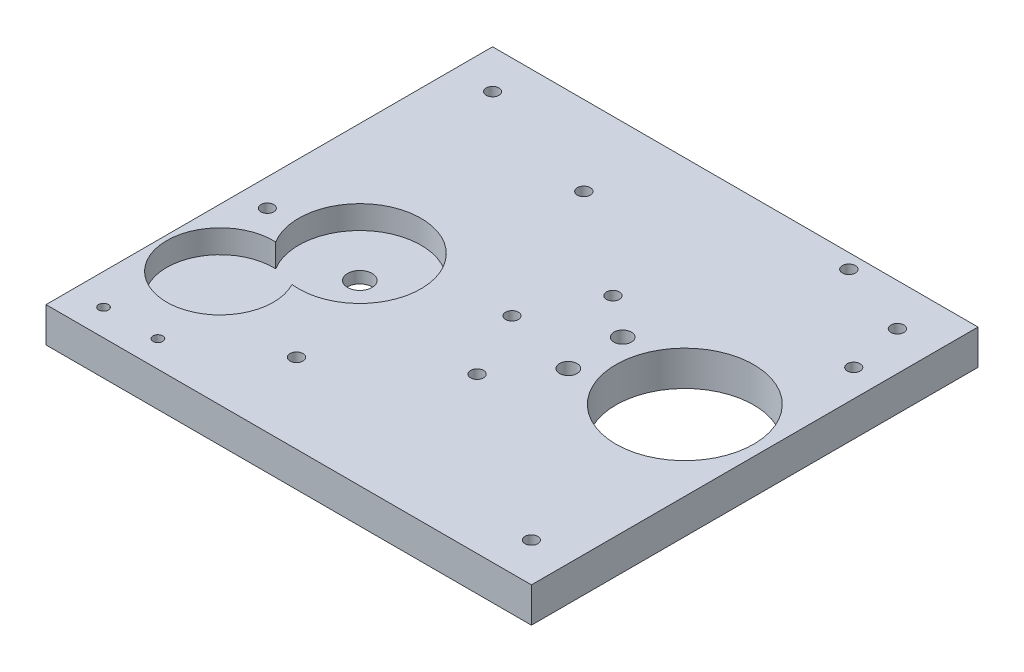
ISO-10303-21;
HEADER;
FILE_DESCRIPTION(('STEP AP214'),'2;1');
FILE_NAME('part.step','',(''),(''),'','','');
FILE_SCHEMA(('AUTOMOTIVE_DESIGN { 1 0 10303 214 1 1 1 1 }'));
ENDSEC;
DATA;
#1=APPLICATION_CONTEXT('core data for automotive mechanical design processes');
#2=APPLICATION_PROTOCOL_DEFINITION('international standard','automotive_design',2000,#1);
#3=PRODUCT_CONTEXT('',#1,'mechanical');
#4=PRODUCT('Part','Part','',(#3));
#5=PRODUCT_RELATED_PRODUCT_CATEGORY('part','',(#4));
#6=PRODUCT_DEFINITION_FORMATION('','',#4);
#7=PRODUCT_DEFINITION_CONTEXT('part definition',#1,'design');
#8=PRODUCT_DEFINITION('design','',#6,#7);
#9=PRODUCT_DEFINITION_SHAPE('','',#8);
#10=(LENGTH_UNIT() NAMED_UNIT(*) SI_UNIT(.MILLI.,.METRE.));
#11=(NAMED_UNIT(*) PLANE_ANGLE_UNIT() SI_UNIT($,.RADIAN.));
#12=(NAMED_UNIT(*) SI_UNIT($,.STERADIAN.) SOLID_ANGLE_UNIT());
#13=UNCERTAINTY_MEASURE_WITH_UNIT(LENGTH_MEASURE(1.E-05),#10,'distance_accuracy_value','');
#14=(GEOMETRIC_REPRESENTATION_CONTEXT(3) GLOBAL_UNCERTAINTY_ASSIGNED_CONTEXT((#13)) GLOBAL_UNIT_ASSIGNED_CONTEXT((#10,
#11,#12)) REPRESENTATION_CONTEXT('',''));
#15=CARTESIAN_POINT('',(0.,0.,0.));
#16=DIRECTION('',(0.,0.,1.));
#17=DIRECTION('',(1.,0.,0.));
#18=AXIS2_PLACEMENT_3D('',#15,#16,#17);
#19=CARTESIAN_POINT('',(0.,9.,0.));
#20=DIRECTION('',(0.,-1.,0.));
#21=DIRECTION('',(0.,0.,-1.));
#22=AXIS2_PLACEMENT_3D('',#19,#20,#21);
#23=PLANE('',#22);
#24=CARTESIAN_POINT('',(9.99999999999999,9.,-105.));
#25=DIRECTION('',(0.,1.,0.));
#26=DIRECTION('',(0.,0.,1.));
#27=AXIS2_PLACEMENT_3D('',#24,#25,#26);
#28=CIRCLE('',#27,1.64999999999999);
#29=CARTESIAN_POINT('',(9.99999999999999,9.,-103.35));
#30=VERTEX_POINT('',#29);
#31=EDGE_CURVE('E647',#30,#30,#28,.T.);
#32=ORIENTED_EDGE('',*,*,#31,.F.);
#33=EDGE_LOOP('',(#32));
#34=FACE_BOUND('',#33,.T.);
#35=CARTESIAN_POINT('',(118.,9.,-90.));
#36=DIRECTION('',(0.,1.,0.));
#37=DIRECTION('',(0.,0.,1.));
#38=AXIS2_PLACEMENT_3D('',#35,#36,#37);
#39=CIRCLE('',#38,1.64999999999998);
#40=CARTESIAN_POINT('',(118.,9.,-88.35));
#41=VERTEX_POINT('',#40);
#42=EDGE_CURVE('E238',#41,#41,#39,.T.);
#43=ORIENTED_EDGE('',*,*,#42,.F.);
#44=EDGE_LOOP('',(#43));
#45=FACE_BOUND('',#44,.T.);
#46=CARTESIAN_POINT('',(115.,9.,-10.));
#47=DIRECTION('',(0.,1.,0.));
#48=DIRECTION('',(0.,0.,1.));
#49=AXIS2_PLACEMENT_3D('',#46,#47,#48);
#50=CIRCLE('',#49,1.64999999999998);
#51=CARTESIAN_POINT('',(115.,9.,-8.35000000000001));
#52=VERTEX_POINT('',#51);
#53=EDGE_CURVE('E227',#52,#52,#50,.T.);
#54=ORIENTED_EDGE('',*,*,#53,.F.);
#55=EDGE_LOOP('',(#54));
#56=FACE_BOUND('',#55,.T.);
#57=CARTESIAN_POINT('',(7.,9.,-50.));
#58=DIRECTION('',(0.,1.,0.));
#59=DIRECTION('',(0.,0.,1.));
#60=AXIS2_PLACEMENT_3D('',#57,#58,#59);
#61=CIRCLE('',#60,1.64999999999999);
#62=CARTESIAN_POINT('',(7.,9.,-48.35));
#63=VERTEX_POINT('',#62);
#64=EDGE_CURVE('E226',#63,#63,#61,.T.);
#65=ORIENTED_EDGE('',*,*,#64,.F.);
#66=EDGE_LOOP('',(#65));
#67=FACE_BOUND('',#66,.T.);
#68=CARTESIAN_POINT('',(7.99999999999999,9.,-6.82025553603353));
#69=DIRECTION('',(0.,1.,0.));
#70=DIRECTION('',(0.,0.,1.));
#71=AXIS2_PLACEMENT_3D('',#68,#69,#70);
#72=CIRCLE('',#71,1.25);
#73=CARTESIAN_POINT('',(7.99999999999999,9.,-5.57025553603353));
#74=VERTEX_POINT('',#73);
#75=EDGE_CURVE('E116',#74,#74,#72,.T.);
#76=ORIENTED_EDGE('',*,*,#75,.F.);
#77=EDGE_LOOP('',(#76));
#78=FACE_BOUND('',#77,.T.);
#79=CARTESIAN_POINT('',(22.,9.,-6.82025553603353));
#80=DIRECTION('',(0.,1.,0.));
#81=DIRECTION('',(0.,0.,1.));
#82=AXIS2_PLACEMENT_3D('',#79,#80,#81);
#83=CIRCLE('',#82,1.25);
#84=CARTESIAN_POINT('',(22.,9.,-5.57025553603354));
#85=VERTEX_POINT('',#84);
#86=EDGE_CURVE('E115',#85,#85,#83,.T.);
#87=ORIENTED_EDGE('',*,*,#86,.F.);
#88=EDGE_LOOP('',(#87));
#89=FACE_BOUND('',#88,.T.);
#90=CARTESIAN_POINT('',(81.5,9.,-53.));
#91=DIRECTION('',(0.,1.,0.));
#92=DIRECTION('',(0.,0.,-1.));
#93=AXIS2_PLACEMENT_3D('',#90,#91,#92);
#94=CIRCLE('',#93,2.24999999999999);
#95=CARTESIAN_POINT('',(81.5,9.,-55.25));
#96=VERTEX_POINT('',#95);
#97=EDGE_CURVE('E128',#96,#96,#94,.T.);
#98=ORIENTED_EDGE('',*,*,#97,.F.);
#99=EDGE_LOOP('',(#98));
#100=FACE_BOUND('',#99,.T.);
#101=CARTESIAN_POINT('',(44.,9.,-20.5));
#102=DIRECTION('',(0.,1.,0.));
#103=DIRECTION('',(0.,0.,-1.));
#104=AXIS2_PLACEMENT_3D('',#101,#102,#103);
#105=CIRCLE('',#104,1.675);
#106=CARTESIAN_POINT('',(44.,9.,-22.175));
#107=VERTEX_POINT('',#106);
#108=EDGE_CURVE('E163',#107,#107,#105,.T.);
#109=ORIENTED_EDGE('',*,*,#108,.F.);
#110=EDGE_LOOP('',(#109));
#111=FACE_BOUND('',#110,.T.);
#112=CARTESIAN_POINT('',(71.,9.,-40.));
#113=DIRECTION('',(0.,1.,0.));
#114=DIRECTION('',(0.,0.,-1.));
#115=AXIS2_PLACEMENT_3D('',#112,#113,#114);
#116=CIRCLE('',#115,1.675);
#117=CARTESIAN_POINT('',(71.,9.,-41.675));
#118=VERTEX_POINT('',#117);
#119=EDGE_CURVE('E157',#118,#118,#116,.T.);
#120=ORIENTED_EDGE('',*,*,#119,.F.);
#121=EDGE_LOOP('',(#120));
#122=FACE_BOUND('',#121,.T.);
#123=CARTESIAN_POINT('',(115.,9.,-104.25));
#124=DIRECTION('',(0.,1.,0.));
#125=DIRECTION('',(0.,0.,1.));
#126=AXIS2_PLACEMENT_3D('',#123,#124,#125);
#127=CIRCLE('',#126,1.675);
#128=CARTESIAN_POINT('',(115.,9.,-102.575));
#129=VERTEX_POINT('',#128);
#130=EDGE_CURVE('E151',#129,#129,#127,.T.);
#131=ORIENTED_EDGE('',*,*,#130,.F.);
#132=EDGE_LOOP('',(#131));
#133=FACE_BOUND('',#132,.T.);
#134=CARTESIAN_POINT('',(95.5,9.,-111.25));
#135=DIRECTION('',(0.,1.,0.));
#136=DIRECTION('',(0.,0.,1.));
#137=AXIS2_PLACEMENT_3D('',#134,#135,#136);
#138=CIRCLE('',#137,1.675);
#139=CARTESIAN_POINT('',(95.5,9.,-109.575));
#140=VERTEX_POINT('',#139);
#141=EDGE_CURVE('E145',#140,#140,#138,.T.);
#142=ORIENTED_EDGE('',*,*,#141,.F.);
#143=EDGE_LOOP('',(#142));
#144=FACE_BOUND('',#143,.T.);
#145=CARTESIAN_POINT('',(81.5,9.,-67.));
#146=DIRECTION('',(0.,1.,0.));
#147=DIRECTION('',(0.,0.,1.));
#148=AXIS2_PLACEMENT_3D('',#145,#146,#147);
#149=CIRCLE('',#148,2.24999999999999);
#150=CARTESIAN_POINT('',(81.5,9.,-64.75));
#151=VERTEX_POINT('',#150);
#152=EDGE_CURVE('E139',#151,#151,#149,.T.);
#153=ORIENTED_EDGE('',*,*,#152,.F.);
#154=EDGE_LOOP('',(#153));
#155=FACE_BOUND('',#154,.T.);
#156=CARTESIAN_POINT('',(44.,9.,-94.5));
#157=DIRECTION('',(0.,1.,0.));
#158=DIRECTION('',(0.,0.,1.));
#159=AXIS2_PLACEMENT_3D('',#156,#157,#158);
#160=CIRCLE('',#159,1.675);
#161=CARTESIAN_POINT('',(44.,9.,-92.825));
#162=VERTEX_POINT('',#161);
#163=EDGE_CURVE('E133',#162,#162,#160,.T.);
#164=ORIENTED_EDGE('',*,*,#163,.F.);
#165=EDGE_LOOP('',(#164));
#166=FACE_BOUND('',#165,.T.);
#167=CARTESIAN_POINT('',(71.,9.,-75.));
#168=DIRECTION('',(0.,1.,0.));
#169=DIRECTION('',(0.,0.,1.));
#170=AXIS2_PLACEMENT_3D('',#167,#168,#169);
#171=CIRCLE('',#170,1.675);
#172=CARTESIAN_POINT('',(71.,9.,-73.325));
#173=VERTEX_POINT('',#172);
#174=EDGE_CURVE('E132',#173,#173,#171,.T.);
#175=ORIENTED_EDGE('',*,*,#174,.F.);
#176=EDGE_LOOP('',(#175));
#177=FACE_BOUND('',#176,.T.);
#178=CARTESIAN_POINT('',(104.5,9.,-60.));
#179=DIRECTION('',(0.,1.,0.));
#180=DIRECTION('',(0.,0.,1.));
#181=AXIS2_PLACEMENT_3D('',#178,#179,#180);
#182=CIRCLE('',#181,17.75);
#183=CARTESIAN_POINT('',(104.5,9.,-42.25));
#184=VERTEX_POINT('',#183);
#185=EDGE_CURVE('E174',#184,#184,#182,.T.);
#186=ORIENTED_EDGE('',*,*,#185,.F.);
#187=EDGE_LOOP('',(#186));
#188=FACE_BOUND('',#187,.T.);
#189=CARTESIAN_POINT('',(29.01540546,9.,-51.79347369));
#190=DIRECTION('',(0.,1.,0.));
#191=DIRECTION('',(0.,0.,1.));
#192=AXIS2_PLACEMENT_3D('',#189,#190,#191);
#193=CIRCLE('',#192,15.75);
#194=CARTESIAN_POINT('',(27.2076918799537,9.,-36.1475581970505));
#195=VERTEX_POINT('',#194);
#196=CARTESIAN_POINT('',(15.5903353441151,9.,-43.5575771156388));
#197=VERTEX_POINT('',#196);
#198=EDGE_CURVE('E190',#195,#197,#193,.T.);
#199=ORIENTED_EDGE('',*,*,#198,.F.);
#200=CARTESIAN_POINT('',(15.,9.,-29.8202555360335));
#201=DIRECTION('',(0.,1.,0.));
#202=DIRECTION('',(0.,0.,1.));
#203=AXIS2_PLACEMENT_3D('',#200,#201,#202);
#204=CIRCLE('',#203,13.75);
#205=EDGE_CURVE('E54',#197,#195,#204,.T.);
#206=ORIENTED_EDGE('',*,*,#205,.F.);
#207=EDGE_LOOP('',(#199,#206));
#208=FACE_BOUND('',#207,.T.);
#209=DIRECTION('',(0.,0.,1.));
#210=VECTOR('',#209,1.);
#211=CARTESIAN_POINT('',(0.,9.,0.));
#212=LINE('',#211,#210);
#213=CARTESIAN_POINT('',(0.,9.,-115.));
#214=VERTEX_POINT('',#213);
#215=CARTESIAN_POINT('',(0.,9.,0.));
#216=VERTEX_POINT('',#215);
#217=EDGE_CURVE('E201',#214,#216,#212,.T.);
#218=ORIENTED_EDGE('',*,*,#217,.T.);
#219=DIRECTION('',(1.,0.,0.));
#220=VECTOR('',#219,1.);
#221=CARTESIAN_POINT('',(0.,9.,0.));
#222=LINE('',#221,#220);
#223=CARTESIAN_POINT('',(125.,9.,0.));
#224=VERTEX_POINT('',#223);
#225=EDGE_CURVE('E91',#216,#224,#222,.T.);
#226=ORIENTED_EDGE('',*,*,#225,.T.);
#227=DIRECTION('',(0.,0.,-1.));
#228=VECTOR('',#227,1.);
#229=CARTESIAN_POINT('',(125.,9.,0.));
#230=LINE('',#229,#228);
#231=CARTESIAN_POINT('',(125.,9.,-115.));
#232=VERTEX_POINT('',#231);
#233=EDGE_CURVE('E204',#224,#232,#230,.T.);
#234=ORIENTED_EDGE('',*,*,#233,.T.);
#235=DIRECTION('',(-1.,0.,0.));
#236=VECTOR('',#235,1.);
#237=CARTESIAN_POINT('',(0.,9.,-115.));
#238=LINE('',#237,#236);
#239=EDGE_CURVE('E63',#232,#214,#238,.T.);
#240=ORIENTED_EDGE('',*,*,#239,.T.);
#241=EDGE_LOOP('',(#218,#226,#234,#240));
#242=FACE_BOUND('',#241,.T.);
#243=CARTESIAN_POINT('',(62.5,9.,-57.5));
#244=DIRECTION('',(0.,1.,0.));
#245=DIRECTION('',(0.,0.,1.));
#246=AXIS2_PLACEMENT_3D('',#243,#244,#245);
#247=CIRCLE('',#246,1.64999999999999);
#248=CARTESIAN_POINT('',(62.5,9.,-55.85));
#249=VERTEX_POINT('',#248);
#250=EDGE_CURVE('E223',#249,#249,#247,.T.);
#251=ORIENTED_EDGE('',*,*,#250,.F.);
#252=EDGE_LOOP('',(#251));
#253=FACE_BOUND('',#252,.T.);
#254=ADVANCED_FACE('F37',(#34,#45,#56,#67,#78,#89,#100,#111,#122,#133,#144,#155,#166,#177,#188,
#208,#242,#253),#23,.F.);
#255=CARTESIAN_POINT('',(0.,9.,0.));
#256=DIRECTION('',(1.,0.,0.));
#257=DIRECTION('',(0.,0.,-1.));
#258=AXIS2_PLACEMENT_3D('',#255,#256,#257);
#259=PLANE('',#258);
#260=DIRECTION('',(0.,0.,1.));
#261=VECTOR('',#260,1.);
#262=CARTESIAN_POINT('',(0.,0.,0.));
#263=LINE('',#262,#261);
#264=CARTESIAN_POINT('',(0.,0.,-115.));
#265=VERTEX_POINT('',#264);
#266=CARTESIAN_POINT('',(0.,0.,0.));
#267=VERTEX_POINT('',#266);
#268=EDGE_CURVE('E199',#265,#267,#263,.T.);
#269=ORIENTED_EDGE('',*,*,#268,.T.);
#270=DIRECTION('',(0.,-1.,0.));
#271=VECTOR('',#270,1.);
#272=CARTESIAN_POINT('',(0.,9.,0.));
#273=LINE('',#272,#271);
#274=EDGE_CURVE('E11',#216,#267,#273,.T.);
#275=ORIENTED_EDGE('',*,*,#274,.F.);
#276=ORIENTED_EDGE('',*,*,#217,.F.);
#277=DIRECTION('',(0.,-1.,0.));
#278=VECTOR('',#277,1.);
#279=CARTESIAN_POINT('',(0.,9.,-115.));
#280=LINE('',#279,#278);
#281=EDGE_CURVE('E207',#214,#265,#280,.T.);
#282=ORIENTED_EDGE('',*,*,#281,.T.);
#283=EDGE_LOOP('',(#269,#275,#276,#282));
#284=FACE_BOUND('',#283,.T.);
#285=ADVANCED_FACE('F39',(#284),#259,.F.);
#286=CARTESIAN_POINT('',(0.,9.,0.));
#287=DIRECTION('',(0.,0.,-1.));
#288=DIRECTION('',(-1.,0.,0.));
#289=AXIS2_PLACEMENT_3D('',#286,#287,#288);
#290=PLANE('',#289);
#291=DIRECTION('',(1.,0.,0.));
#292=VECTOR('',#291,1.);
#293=CARTESIAN_POINT('',(0.,0.,0.));
#294=LINE('',#293,#292);
#295=CARTESIAN_POINT('',(125.,0.,0.));
#296=VERTEX_POINT('',#295);
#297=EDGE_CURVE('E210',#267,#296,#294,.T.);
#298=ORIENTED_EDGE('',*,*,#297,.T.);
#299=DIRECTION('',(0.,-1.,0.));
#300=VECTOR('',#299,1.);
#301=CARTESIAN_POINT('',(125.,9.,0.));
#302=LINE('',#301,#300);
#303=EDGE_CURVE('E46',#224,#296,#302,.T.);
#304=ORIENTED_EDGE('',*,*,#303,.F.);
#305=ORIENTED_EDGE('',*,*,#225,.F.);
#306=ORIENTED_EDGE('',*,*,#274,.T.);
#307=EDGE_LOOP('',(#298,#304,#305,#306));
#308=FACE_BOUND('',#307,.T.);
#309=ADVANCED_FACE('F254',(#308),#290,.F.);
#310=CARTESIAN_POINT('',(125.,9.,0.));
#311=DIRECTION('',(-1.,0.,0.));
#312=DIRECTION('',(0.,0.,1.));
#313=AXIS2_PLACEMENT_3D('',#310,#311,#312);
#314=PLANE('',#313);
#315=DIRECTION('',(0.,0.,-1.));
#316=VECTOR('',#315,1.);
#317=CARTESIAN_POINT('',(125.,0.,0.));
#318=LINE('',#317,#316);
#319=CARTESIAN_POINT('',(125.,0.,-115.));
#320=VERTEX_POINT('',#319);
#321=EDGE_CURVE('E212',#296,#320,#318,.T.);
#322=ORIENTED_EDGE('',*,*,#321,.T.);
#323=DIRECTION('',(0.,-1.,0.));
#324=VECTOR('',#323,1.);
#325=CARTESIAN_POINT('',(125.,9.,-115.));
#326=LINE('',#325,#324);
#327=EDGE_CURVE('E216',#232,#320,#326,.T.);
#328=ORIENTED_EDGE('',*,*,#327,.F.);
#329=ORIENTED_EDGE('',*,*,#233,.F.);
#330=ORIENTED_EDGE('',*,*,#303,.T.);
#331=EDGE_LOOP('',(#322,#328,#329,#330));
#332=FACE_BOUND('',#331,.T.);
#333=ADVANCED_FACE('F269',(#332),#314,.F.);
#334=CARTESIAN_POINT('',(0.,9.,-115.));
#335=DIRECTION('',(0.,0.,1.));
#336=DIRECTION('',(1.,0.,0.));
#337=AXIS2_PLACEMENT_3D('',#334,#335,#336);
#338=PLANE('',#337);
#339=DIRECTION('',(-1.,0.,0.));
#340=VECTOR('',#339,1.);
#341=CARTESIAN_POINT('',(0.,0.,-115.));
#342=LINE('',#341,#340);
#343=EDGE_CURVE('E84',#320,#265,#342,.T.);
#344=ORIENTED_EDGE('',*,*,#343,.T.);
#345=ORIENTED_EDGE('',*,*,#281,.F.);
#346=ORIENTED_EDGE('',*,*,#239,.F.);
#347=ORIENTED_EDGE('',*,*,#327,.T.);
#348=EDGE_LOOP('',(#344,#345,#346,#347));
#349=FACE_BOUND('',#348,.T.);
#350=ADVANCED_FACE('F265',(#349),#338,.F.);
#351=CARTESIAN_POINT('',(0.,0.,0.));
#352=DIRECTION('',(0.,-1.,0.));
#353=DIRECTION('',(0.,0.,-1.));
#354=AXIS2_PLACEMENT_3D('',#351,#352,#353);
#355=PLANE('',#354);
#356=CARTESIAN_POINT('',(9.99999999999999,0.,-105.));
#357=DIRECTION('',(0.,-1.,0.));
#358=DIRECTION('',(0.,0.,-1.));
#359=AXIS2_PLACEMENT_3D('',#356,#357,#358);
#360=CIRCLE('',#359,1.64999999999999);
#361=CARTESIAN_POINT('',(9.99999999999999,0.,-106.65));
#362=VERTEX_POINT('',#361);
#363=EDGE_CURVE('E645',#362,#362,#360,.T.);
#364=ORIENTED_EDGE('',*,*,#363,.F.);
#365=EDGE_LOOP('',(#364));
#366=FACE_BOUND('',#365,.T.);
#367=CARTESIAN_POINT('',(118.,0.,-90.));
#368=DIRECTION('',(0.,-1.,0.));
#369=DIRECTION('',(0.,0.,-1.));
#370=AXIS2_PLACEMENT_3D('',#367,#368,#369);
#371=CIRCLE('',#370,1.64999999999999);
#372=CARTESIAN_POINT('',(118.,0.,-91.65));
#373=VERTEX_POINT('',#372);
#374=EDGE_CURVE('E41',#373,#373,#371,.T.);
#375=ORIENTED_EDGE('',*,*,#374,.F.);
#376=EDGE_LOOP('',(#375));
#377=FACE_BOUND('',#376,.T.);
#378=CARTESIAN_POINT('',(115.,0.,-10.));
#379=DIRECTION('',(0.,-1.,0.));
#380=DIRECTION('',(0.,0.,-1.));
#381=AXIS2_PLACEMENT_3D('',#378,#379,#380);
#382=CIRCLE('',#381,1.64999999999999);
#383=CARTESIAN_POINT('',(115.,0.,-11.65));
#384=VERTEX_POINT('',#383);
#385=EDGE_CURVE('E224',#384,#384,#382,.T.);
#386=ORIENTED_EDGE('',*,*,#385,.F.);
#387=EDGE_LOOP('',(#386));
#388=FACE_BOUND('',#387,.T.);
#389=CARTESIAN_POINT('',(7.,0.,-50.));
#390=DIRECTION('',(0.,-1.,0.));
#391=DIRECTION('',(0.,0.,-1.));
#392=AXIS2_PLACEMENT_3D('',#389,#390,#391);
#393=CIRCLE('',#392,1.64999999999999);
#394=CARTESIAN_POINT('',(7.,0.,-51.65));
#395=VERTEX_POINT('',#394);
#396=EDGE_CURVE('E231',#395,#395,#393,.T.);
#397=ORIENTED_EDGE('',*,*,#396,.F.);
#398=EDGE_LOOP('',(#397));
#399=FACE_BOUND('',#398,.T.);
#400=CARTESIAN_POINT('',(62.5,0.,-57.5));
#401=DIRECTION('',(0.,-1.,0.));
#402=DIRECTION('',(0.,0.,-1.));
#403=AXIS2_PLACEMENT_3D('',#400,#401,#402);
#404=CIRCLE('',#403,1.64999999999999);
#405=CARTESIAN_POINT('',(62.5,0.,-59.15));
#406=VERTEX_POINT('',#405);
#407=EDGE_CURVE('E122',#406,#406,#404,.T.);
#408=ORIENTED_EDGE('',*,*,#407,.F.);
#409=EDGE_LOOP('',(#408));
#410=FACE_BOUND('',#409,.T.);
#411=CARTESIAN_POINT('',(104.5,0.,-60.));
#412=DIRECTION('',(0.,1.,0.));
#413=DIRECTION('',(0.,0.,1.));
#414=AXIS2_PLACEMENT_3D('',#411,#412,#413);
#415=CIRCLE('',#414,17.75);
#416=CARTESIAN_POINT('',(104.5,0.,-42.25));
#417=VERTEX_POINT('',#416);
#418=EDGE_CURVE('E177',#417,#417,#415,.T.);
#419=ORIENTED_EDGE('',*,*,#418,.T.);
#420=EDGE_LOOP('',(#419));
#421=FACE_BOUND('',#420,.T.);
#422=CARTESIAN_POINT('',(29.01540546,0.,-51.79347369));
#423=DIRECTION('',(0.,1.,0.));
#424=DIRECTION('',(0.,0.,1.));
#425=AXIS2_PLACEMENT_3D('',#422,#423,#424);
#426=CIRCLE('',#425,3.15);
#427=CARTESIAN_POINT('',(29.01540546,0.,-48.64347369));
#428=VERTEX_POINT('',#427);
#429=EDGE_CURVE('E180',#428,#428,#426,.T.);
#430=ORIENTED_EDGE('',*,*,#429,.T.);
#431=EDGE_LOOP('',(#430));
#432=FACE_BOUND('',#431,.T.);
#433=ORIENTED_EDGE('',*,*,#268,.F.);
#434=ORIENTED_EDGE('',*,*,#343,.F.);
#435=ORIENTED_EDGE('',*,*,#321,.F.);
#436=ORIENTED_EDGE('',*,*,#297,.F.);
#437=EDGE_LOOP('',(#433,#434,#435,#436));
#438=FACE_BOUND('',#437,.T.);
#439=ADVANCED_FACE('F262',(#366,#377,#388,#399,#410,#421,#432,#438),#355,.T.);
#440=CARTESIAN_POINT('',(15.,3.,-29.8202555360335));
#441=DIRECTION('',(0.,1.,0.));
#442=DIRECTION('',(0.,0.,1.));
#443=AXIS2_PLACEMENT_3D('',#440,#441,#442);
#444=CYLINDRICAL_SURFACE('',#443,13.75);
#445=ORIENTED_EDGE('',*,*,#205,.T.);
#446=DIRECTION('',(0.,1.,0.));
#447=VECTOR('',#446,1.);
#448=CARTESIAN_POINT('',(27.2076918799537,3.,-36.1475581970505));
#449=LINE('',#448,#447);
#450=CARTESIAN_POINT('',(27.2076918799537,3.,-36.1475581970505));
#451=VERTEX_POINT('',#450);
#452=EDGE_CURVE('E193',#451,#195,#449,.T.);
#453=ORIENTED_EDGE('',*,*,#452,.F.);
#454=CARTESIAN_POINT('',(15.,3.,-29.8202555360335));
#455=DIRECTION('',(0.,1.,0.));
#456=DIRECTION('',(0.,0.,1.));
#457=AXIS2_PLACEMENT_3D('',#454,#455,#456);
#458=CIRCLE('',#457,13.75);
#459=CARTESIAN_POINT('',(15.5903353441151,3.,-43.5575771156388));
#460=VERTEX_POINT('',#459);
#461=EDGE_CURVE('E186',#460,#451,#458,.T.);
#462=ORIENTED_EDGE('',*,*,#461,.F.);
#463=DIRECTION('',(0.,1.,0.));
#464=VECTOR('',#463,1.);
#465=CARTESIAN_POINT('',(15.5903353441151,3.,-43.5575771156388));
#466=LINE('',#465,#464);
#467=EDGE_CURVE('E197',#460,#197,#466,.T.);
#468=ORIENTED_EDGE('',*,*,#467,.T.);
#469=EDGE_LOOP('',(#445,#453,#462,#468));
#470=FACE_BOUND('',#469,.T.);
#471=ADVANCED_FACE('F260',(#470),#444,.F.);
#472=CARTESIAN_POINT('',(29.01540546,3.,-51.79347369));
#473=DIRECTION('',(0.,1.,0.));
#474=DIRECTION('',(0.,0.,1.));
#475=AXIS2_PLACEMENT_3D('',#472,#473,#474);
#476=CYLINDRICAL_SURFACE('',#475,15.75);
#477=ORIENTED_EDGE('',*,*,#198,.T.);
#478=ORIENTED_EDGE('',*,*,#467,.F.);
#479=CARTESIAN_POINT('',(29.01540546,3.,-51.79347369));
#480=DIRECTION('',(0.,1.,0.));
#481=DIRECTION('',(0.,0.,1.));
#482=AXIS2_PLACEMENT_3D('',#479,#480,#481);
#483=CIRCLE('',#482,15.75);
#484=EDGE_CURVE('E189',#451,#460,#483,.T.);
#485=ORIENTED_EDGE('',*,*,#484,.F.);
#486=ORIENTED_EDGE('',*,*,#452,.T.);
#487=EDGE_LOOP('',(#477,#478,#485,#486));
#488=FACE_BOUND('',#487,.T.);
#489=ADVANCED_FACE('F303',(#488),#476,.F.);
#490=CARTESIAN_POINT('',(0.,3.,0.));
#491=DIRECTION('',(0.,1.,0.));
#492=DIRECTION('',(0.,0.,1.));
#493=AXIS2_PLACEMENT_3D('',#490,#491,#492);
#494=PLANE('',#493);
#495=CARTESIAN_POINT('',(29.01540546,3.,-51.79347369));
#496=DIRECTION('',(0.,1.,0.));
#497=DIRECTION('',(0.,0.,1.));
#498=AXIS2_PLACEMENT_3D('',#495,#496,#497);
#499=CIRCLE('',#498,3.15);
#500=CARTESIAN_POINT('',(29.01540546,3.,-48.64347369));
#501=VERTEX_POINT('',#500);
#502=EDGE_CURVE('E185',#501,#501,#499,.T.);
#503=ORIENTED_EDGE('',*,*,#502,.F.);
#504=EDGE_LOOP('',(#503));
#505=FACE_BOUND('',#504,.T.);
#506=ORIENTED_EDGE('',*,*,#461,.T.);
#507=ORIENTED_EDGE('',*,*,#484,.T.);
#508=EDGE_LOOP('',(#506,#507));
#509=FACE_BOUND('',#508,.T.);
#510=ADVANCED_FACE('F309',(#505,#509),#494,.T.);
#511=CARTESIAN_POINT('',(29.01540546,0.,-51.79347369));
#512=DIRECTION('',(0.,1.,0.));
#513=DIRECTION('',(0.,0.,1.));
#514=AXIS2_PLACEMENT_3D('',#511,#512,#513);
#515=CYLINDRICAL_SURFACE('',#514,3.15);
#516=ORIENTED_EDGE('',*,*,#502,.T.);
#517=EDGE_LOOP('',(#516));
#518=FACE_BOUND('',#517,.T.);
#519=ORIENTED_EDGE('',*,*,#429,.F.);
#520=EDGE_LOOP('',(#519));
#521=FACE_BOUND('',#520,.T.);
#522=ADVANCED_FACE('F316',(#518,#521),#515,.F.);
#523=CARTESIAN_POINT('',(104.5,0.,-60.));
#524=DIRECTION('',(0.,1.,0.));
#525=DIRECTION('',(0.,0.,1.));
#526=AXIS2_PLACEMENT_3D('',#523,#524,#525);
#527=CYLINDRICAL_SURFACE('',#526,17.75);
#528=ORIENTED_EDGE('',*,*,#418,.F.);
#529=EDGE_LOOP('',(#528));
#530=FACE_BOUND('',#529,.T.);
#531=ORIENTED_EDGE('',*,*,#185,.T.);
#532=EDGE_LOOP('',(#531));
#533=FACE_BOUND('',#532,.T.);
#534=ADVANCED_FACE('F324',(#530,#533),#527,.F.);
#535=CARTESIAN_POINT('',(71.,4.,-75.));
#536=DIRECTION('',(0.,1.,0.));
#537=DIRECTION('',(0.,0.,1.));
#538=AXIS2_PLACEMENT_3D('',#535,#536,#537);
#539=CYLINDRICAL_SURFACE('',#538,1.675);
#540=CARTESIAN_POINT('',(71.,4.,-75.));
#541=DIRECTION('',(0.,1.,0.));
#542=DIRECTION('',(0.,0.,1.));
#543=AXIS2_PLACEMENT_3D('',#540,#541,#542);
#544=CIRCLE('',#543,1.675);
#545=CARTESIAN_POINT('',(71.,4.,-73.325));
#546=VERTEX_POINT('',#545);
#547=EDGE_CURVE('E171',#546,#546,#544,.T.);
#548=ORIENTED_EDGE('',*,*,#547,.F.);
#549=EDGE_LOOP('',(#548));
#550=FACE_BOUND('',#549,.T.);
#551=ORIENTED_EDGE('',*,*,#174,.T.);
#552=EDGE_LOOP('',(#551));
#553=FACE_BOUND('',#552,.T.);
#554=ADVANCED_FACE('F332',(#550,#553),#539,.F.);
#555=CARTESIAN_POINT('',(71.,4.,-75.));
#556=DIRECTION('',(0.,1.,0.));
#557=DIRECTION('',(0.,0.,1.));
#558=AXIS2_PLACEMENT_3D('',#555,#556,#557);
#559=PLANE('',#558);
#560=ORIENTED_EDGE('',*,*,#547,.T.);
#561=EDGE_LOOP('',(#560));
#562=FACE_BOUND('',#561,.T.);
#563=ADVANCED_FACE('F340',(#562),#559,.T.);
#564=CARTESIAN_POINT('',(44.,4.,-94.5));
#565=DIRECTION('',(0.,1.,0.));
#566=DIRECTION('',(0.,0.,1.));
#567=AXIS2_PLACEMENT_3D('',#564,#565,#566);
#568=CYLINDRICAL_SURFACE('',#567,1.675);
#569=CARTESIAN_POINT('',(44.,4.,-94.5));
#570=DIRECTION('',(0.,1.,0.));
#571=DIRECTION('',(0.,0.,1.));
#572=AXIS2_PLACEMENT_3D('',#569,#570,#571);
#573=CIRCLE('',#572,1.675);
#574=CARTESIAN_POINT('',(44.,4.,-92.825));
#575=VERTEX_POINT('',#574);
#576=EDGE_CURVE('E129',#575,#575,#573,.T.);
#577=ORIENTED_EDGE('',*,*,#576,.F.);
#578=EDGE_LOOP('',(#577));
#579=FACE_BOUND('',#578,.T.);
#580=ORIENTED_EDGE('',*,*,#163,.T.);
#581=EDGE_LOOP('',(#580));
#582=FACE_BOUND('',#581,.T.);
#583=ADVANCED_FACE('F348',(#579,#582),#568,.F.);
#584=CARTESIAN_POINT('',(44.,4.,-94.5));
#585=DIRECTION('',(0.,1.,0.));
#586=DIRECTION('',(0.,0.,1.));
#587=AXIS2_PLACEMENT_3D('',#584,#585,#586);
#588=PLANE('',#587);
#589=ORIENTED_EDGE('',*,*,#576,.T.);
#590=EDGE_LOOP('',(#589));
#591=FACE_BOUND('',#590,.T.);
#592=ADVANCED_FACE('F356',(#591),#588,.T.);
#593=CARTESIAN_POINT('',(81.5,4.,-67.));
#594=DIRECTION('',(0.,1.,0.));
#595=DIRECTION('',(0.,0.,1.));
#596=AXIS2_PLACEMENT_3D('',#593,#594,#595);
#597=CYLINDRICAL_SURFACE('',#596,2.24999999999999);
#598=CARTESIAN_POINT('',(81.5,4.,-67.));
#599=DIRECTION('',(0.,1.,0.));
#600=DIRECTION('',(0.,0.,1.));
#601=AXIS2_PLACEMENT_3D('',#598,#599,#600);
#602=CIRCLE('',#601,2.24999999999999);
#603=CARTESIAN_POINT('',(81.5,4.,-64.75));
#604=VERTEX_POINT('',#603);
#605=EDGE_CURVE('E136',#604,#604,#602,.T.);
#606=ORIENTED_EDGE('',*,*,#605,.F.);
#607=EDGE_LOOP('',(#606));
#608=FACE_BOUND('',#607,.T.);
#609=ORIENTED_EDGE('',*,*,#152,.T.);
#610=EDGE_LOOP('',(#609));
#611=FACE_BOUND('',#610,.T.);
#612=ADVANCED_FACE('F364',(#608,#611),#597,.F.);
#613=CARTESIAN_POINT('',(81.5,4.,-67.));
#614=DIRECTION('',(0.,1.,0.));
#615=DIRECTION('',(0.,0.,1.));
#616=AXIS2_PLACEMENT_3D('',#613,#614,#615);
#617=PLANE('',#616);
#618=ORIENTED_EDGE('',*,*,#605,.T.);
#619=EDGE_LOOP('',(#618));
#620=FACE_BOUND('',#619,.T.);
#621=ADVANCED_FACE('F372',(#620),#617,.T.);
#622=CARTESIAN_POINT('',(95.5,4.,-111.25));
#623=DIRECTION('',(0.,1.,0.));
#624=DIRECTION('',(0.,0.,1.));
#625=AXIS2_PLACEMENT_3D('',#622,#623,#624);
#626=CYLINDRICAL_SURFACE('',#625,1.675);
#627=CARTESIAN_POINT('',(95.5,4.,-111.25));
#628=DIRECTION('',(0.,1.,0.));
#629=DIRECTION('',(0.,0.,1.));
#630=AXIS2_PLACEMENT_3D('',#627,#628,#629);
#631=CIRCLE('',#630,1.675);
#632=CARTESIAN_POINT('',(95.5,4.,-109.575));
#633=VERTEX_POINT('',#632);
#634=EDGE_CURVE('E142',#633,#633,#631,.T.);
#635=ORIENTED_EDGE('',*,*,#634,.F.);
#636=EDGE_LOOP('',(#635));
#637=FACE_BOUND('',#636,.T.);
#638=ORIENTED_EDGE('',*,*,#141,.T.);
#639=EDGE_LOOP('',(#638));
#640=FACE_BOUND('',#639,.T.);
#641=ADVANCED_FACE('F380',(#637,#640),#626,.F.);
#642=CARTESIAN_POINT('',(95.5,4.,-111.25));
#643=DIRECTION('',(0.,1.,0.));
#644=DIRECTION('',(0.,0.,1.));
#645=AXIS2_PLACEMENT_3D('',#642,#643,#644);
#646=PLANE('',#645);
#647=ORIENTED_EDGE('',*,*,#634,.T.);
#648=EDGE_LOOP('',(#647));
#649=FACE_BOUND('',#648,.T.);
#650=ADVANCED_FACE('F388',(#649),#646,.T.);
#651=CARTESIAN_POINT('',(115.,4.,-104.25));
#652=DIRECTION('',(0.,1.,0.));
#653=DIRECTION('',(0.,0.,1.));
#654=AXIS2_PLACEMENT_3D('',#651,#652,#653);
#655=CYLINDRICAL_SURFACE('',#654,1.675);
#656=CARTESIAN_POINT('',(115.,4.,-104.25));
#657=DIRECTION('',(0.,1.,0.));
#658=DIRECTION('',(0.,0.,1.));
#659=AXIS2_PLACEMENT_3D('',#656,#657,#658);
#660=CIRCLE('',#659,1.675);
#661=CARTESIAN_POINT('',(115.,4.,-102.575));
#662=VERTEX_POINT('',#661);
#663=EDGE_CURVE('E148',#662,#662,#660,.T.);
#664=ORIENTED_EDGE('',*,*,#663,.F.);
#665=EDGE_LOOP('',(#664));
#666=FACE_BOUND('',#665,.T.);
#667=ORIENTED_EDGE('',*,*,#130,.T.);
#668=EDGE_LOOP('',(#667));
#669=FACE_BOUND('',#668,.T.);
#670=ADVANCED_FACE('F396',(#666,#669),#655,.F.);
#671=CARTESIAN_POINT('',(115.,4.,-104.25));
#672=DIRECTION('',(0.,1.,0.));
#673=DIRECTION('',(0.,0.,1.));
#674=AXIS2_PLACEMENT_3D('',#671,#672,#673);
#675=PLANE('',#674);
#676=ORIENTED_EDGE('',*,*,#663,.T.);
#677=EDGE_LOOP('',(#676));
#678=FACE_BOUND('',#677,.T.);
#679=ADVANCED_FACE('F404',(#678),#675,.T.);
#680=CARTESIAN_POINT('',(71.,4.,-40.));
#681=DIRECTION('',(0.,1.,0.));
#682=DIRECTION('',(0.,0.,1.));
#683=AXIS2_PLACEMENT_3D('',#680,#681,#682);
#684=CYLINDRICAL_SURFACE('',#683,1.675);
#685=CARTESIAN_POINT('',(71.,4.,-40.));
#686=DIRECTION('',(0.,1.,0.));
#687=DIRECTION('',(0.,0.,-1.));
#688=AXIS2_PLACEMENT_3D('',#685,#686,#687);
#689=CIRCLE('',#688,1.675);
#690=CARTESIAN_POINT('',(71.,4.,-41.675));
#691=VERTEX_POINT('',#690);
#692=EDGE_CURVE('E154',#691,#691,#689,.T.);
#693=ORIENTED_EDGE('',*,*,#692,.F.);
#694=EDGE_LOOP('',(#693));
#695=FACE_BOUND('',#694,.T.);
#696=ORIENTED_EDGE('',*,*,#119,.T.);
#697=EDGE_LOOP('',(#696));
#698=FACE_BOUND('',#697,.T.);
#699=ADVANCED_FACE('F412',(#695,#698),#684,.F.);
#700=CARTESIAN_POINT('',(71.,4.,-40.));
#701=DIRECTION('',(0.,-1.,0.));
#702=DIRECTION('',(0.,0.,-1.));
#703=AXIS2_PLACEMENT_3D('',#700,#701,#702);
#704=PLANE('',#703);
#705=ORIENTED_EDGE('',*,*,#692,.T.);
#706=EDGE_LOOP('',(#705));
#707=FACE_BOUND('',#706,.T.);
#708=ADVANCED_FACE('F420',(#707),#704,.F.);
#709=CARTESIAN_POINT('',(44.,4.,-20.5));
#710=DIRECTION('',(0.,1.,0.));
#711=DIRECTION('',(0.,0.,1.));
#712=AXIS2_PLACEMENT_3D('',#709,#710,#711);
#713=CYLINDRICAL_SURFACE('',#712,1.675);
#714=CARTESIAN_POINT('',(44.,4.,-20.5));
#715=DIRECTION('',(0.,1.,0.));
#716=DIRECTION('',(0.,0.,-1.));
#717=AXIS2_PLACEMENT_3D('',#714,#715,#716);
#718=CIRCLE('',#717,1.675);
#719=CARTESIAN_POINT('',(44.,4.,-22.175));
#720=VERTEX_POINT('',#719);
#721=EDGE_CURVE('E160',#720,#720,#718,.T.);
#722=ORIENTED_EDGE('',*,*,#721,.F.);
#723=EDGE_LOOP('',(#722));
#724=FACE_BOUND('',#723,.T.);
#725=ORIENTED_EDGE('',*,*,#108,.T.);
#726=EDGE_LOOP('',(#725));
#727=FACE_BOUND('',#726,.T.);
#728=ADVANCED_FACE('F428',(#724,#727),#713,.F.);
#729=CARTESIAN_POINT('',(44.,4.,-20.5));
#730=DIRECTION('',(0.,-1.,0.));
#731=DIRECTION('',(0.,0.,-1.));
#732=AXIS2_PLACEMENT_3D('',#729,#730,#731);
#733=PLANE('',#732);
#734=ORIENTED_EDGE('',*,*,#721,.T.);
#735=EDGE_LOOP('',(#734));
#736=FACE_BOUND('',#735,.T.);
#737=ADVANCED_FACE('F436',(#736),#733,.F.);
#738=CARTESIAN_POINT('',(81.5,4.,-53.));
#739=DIRECTION('',(0.,1.,0.));
#740=DIRECTION('',(0.,0.,1.));
#741=AXIS2_PLACEMENT_3D('',#738,#739,#740);
#742=CYLINDRICAL_SURFACE('',#741,2.24999999999999);
#743=CARTESIAN_POINT('',(81.5,4.,-53.));
#744=DIRECTION('',(0.,1.,0.));
#745=DIRECTION('',(0.,0.,-1.));
#746=AXIS2_PLACEMENT_3D('',#743,#744,#745);
#747=CIRCLE('',#746,2.24999999999999);
#748=CARTESIAN_POINT('',(81.5,4.,-55.25));
#749=VERTEX_POINT('',#748);
#750=EDGE_CURVE('E166',#749,#749,#747,.T.);
#751=ORIENTED_EDGE('',*,*,#750,.F.);
#752=EDGE_LOOP('',(#751));
#753=FACE_BOUND('',#752,.T.);
#754=ORIENTED_EDGE('',*,*,#97,.T.);
#755=EDGE_LOOP('',(#754));
#756=FACE_BOUND('',#755,.T.);
#757=ADVANCED_FACE('F444',(#753,#756),#742,.F.);
#758=CARTESIAN_POINT('',(81.5,4.,-53.));
#759=DIRECTION('',(0.,-1.,0.));
#760=DIRECTION('',(0.,0.,-1.));
#761=AXIS2_PLACEMENT_3D('',#758,#759,#760);
#762=PLANE('',#761);
#763=ORIENTED_EDGE('',*,*,#750,.T.);
#764=EDGE_LOOP('',(#763));
#765=FACE_BOUND('',#764,.T.);
#766=ADVANCED_FACE('F452',(#765),#762,.F.);
#767=CARTESIAN_POINT('',(22.,1.5,-6.82025553603353));
#768=DIRECTION('',(0.,1.,0.));
#769=DIRECTION('',(0.,0.,1.));
#770=AXIS2_PLACEMENT_3D('',#767,#768,#769);
#771=CONICAL_SURFACE('',#770,1.25,1.02974425867665);
#772=CARTESIAN_POINT('',(22.,0.748924226215548,-6.82025553603353));
#773=VERTEX_POINT('',#772);
#774=VERTEX_LOOP('',#773);
#775=FACE_BOUND('',#774,.T.);
#776=CARTESIAN_POINT('',(22.,1.5,-6.82025553603353));
#777=DIRECTION('',(0.,1.,0.));
#778=DIRECTION('',(0.,0.,1.));
#779=AXIS2_PLACEMENT_3D('',#776,#777,#778);
#780=CIRCLE('',#779,1.25);
#781=CARTESIAN_POINT('',(22.,1.5,-5.57025553603354));
#782=VERTEX_POINT('',#781);
#783=EDGE_CURVE('E119',#782,#782,#780,.T.);
#784=ORIENTED_EDGE('',*,*,#783,.T.);
#785=EDGE_LOOP('',(#784));
#786=FACE_BOUND('',#785,.T.);
#787=ADVANCED_FACE('F460',(#775,#786),#771,.F.);
#788=CARTESIAN_POINT('',(22.,9.,-6.82025553603353));
#789=DIRECTION('',(0.,1.,0.));
#790=DIRECTION('',(0.,0.,1.));
#791=AXIS2_PLACEMENT_3D('',#788,#789,#790);
#792=CYLINDRICAL_SURFACE('',#791,1.25);
#793=ORIENTED_EDGE('',*,*,#783,.F.);
#794=EDGE_LOOP('',(#793));
#795=FACE_BOUND('',#794,.T.);
#796=ORIENTED_EDGE('',*,*,#86,.T.);
#797=EDGE_LOOP('',(#796));
#798=FACE_BOUND('',#797,.T.);
#799=ADVANCED_FACE('F109',(#795,#798),#792,.F.);
#800=CARTESIAN_POINT('',(7.99999999999999,1.5,-6.82025553603353));
#801=DIRECTION('',(0.,1.,0.));
#802=DIRECTION('',(0.,0.,1.));
#803=AXIS2_PLACEMENT_3D('',#800,#801,#802);
#804=CONICAL_SURFACE('',#803,1.25,1.02974425867665);
#805=CARTESIAN_POINT('',(7.99999999999998,0.748924226215548,-6.82025553603353));
#806=VERTEX_POINT('',#805);
#807=VERTEX_LOOP('',#806);
#808=FACE_BOUND('',#807,.T.);
#809=CARTESIAN_POINT('',(7.99999999999999,1.5,-6.82025553603353));
#810=DIRECTION('',(0.,1.,0.));
#811=DIRECTION('',(0.,0.,1.));
#812=AXIS2_PLACEMENT_3D('',#809,#810,#811);
#813=CIRCLE('',#812,1.25);
#814=CARTESIAN_POINT('',(7.99999999999999,1.5,-5.57025553603354));
#815=VERTEX_POINT('',#814);
#816=EDGE_CURVE('E113',#815,#815,#813,.T.);
#817=ORIENTED_EDGE('',*,*,#816,.T.);
#818=EDGE_LOOP('',(#817));
#819=FACE_BOUND('',#818,.T.);
#820=ADVANCED_FACE('F105',(#808,#819),#804,.F.);
#821=CARTESIAN_POINT('',(7.99999999999999,9.,-6.82025553603353));
#822=DIRECTION('',(0.,1.,0.));
#823=DIRECTION('',(0.,0.,1.));
#824=AXIS2_PLACEMENT_3D('',#821,#822,#823);
#825=CYLINDRICAL_SURFACE('',#824,1.25);
#826=ORIENTED_EDGE('',*,*,#816,.F.);
#827=EDGE_LOOP('',(#826));
#828=FACE_BOUND('',#827,.T.);
#829=ORIENTED_EDGE('',*,*,#75,.T.);
#830=EDGE_LOOP('',(#829));
#831=FACE_BOUND('',#830,.T.);
#832=ADVANCED_FACE('F108',(#828,#831),#825,.F.);
#833=CARTESIAN_POINT('',(62.5,9.,-57.5));
#834=DIRECTION('',(0.,1.,0.));
#835=DIRECTION('',(0.,0.,1.));
#836=AXIS2_PLACEMENT_3D('',#833,#834,#835);
#837=CYLINDRICAL_SURFACE('',#836,1.64999999999999);
#838=ORIENTED_EDGE('',*,*,#407,.T.);
#839=EDGE_LOOP('',(#838));
#840=FACE_BOUND('',#839,.T.);
#841=ORIENTED_EDGE('',*,*,#250,.T.);
#842=EDGE_LOOP('',(#841));
#843=FACE_BOUND('',#842,.T.);
#844=ADVANCED_FACE('F246',(#840,#843),#837,.F.);
#845=CARTESIAN_POINT('',(7.,9.,-50.));
#846=DIRECTION('',(0.,1.,0.));
#847=DIRECTION('',(0.,0.,1.));
#848=AXIS2_PLACEMENT_3D('',#845,#846,#847);
#849=CYLINDRICAL_SURFACE('',#848,1.64999999999999);
#850=ORIENTED_EDGE('',*,*,#396,.T.);
#851=EDGE_LOOP('',(#850));
#852=FACE_BOUND('',#851,.T.);
#853=ORIENTED_EDGE('',*,*,#64,.T.);
#854=EDGE_LOOP('',(#853));
#855=FACE_BOUND('',#854,.T.);
#856=ADVANCED_FACE('F495',(#852,#855),#849,.F.);
#857=CARTESIAN_POINT('',(115.,9.,-10.));
#858=DIRECTION('',(0.,1.,0.));
#859=DIRECTION('',(0.,0.,1.));
#860=AXIS2_PLACEMENT_3D('',#857,#858,#859);
#861=CYLINDRICAL_SURFACE('',#860,1.64999999999999);
#862=ORIENTED_EDGE('',*,*,#385,.T.);
#863=EDGE_LOOP('',(#862));
#864=FACE_BOUND('',#863,.T.);
#865=ORIENTED_EDGE('',*,*,#53,.T.);
#866=EDGE_LOOP('',(#865));
#867=FACE_BOUND('',#866,.T.);
#868=ADVANCED_FACE('F502',(#864,#867),#861,.F.);
#869=CARTESIAN_POINT('',(118.,9.,-90.));
#870=DIRECTION('',(0.,1.,0.));
#871=DIRECTION('',(0.,0.,1.));
#872=AXIS2_PLACEMENT_3D('',#869,#870,#871);
#873=CYLINDRICAL_SURFACE('',#872,1.64999999999999);
#874=ORIENTED_EDGE('',*,*,#374,.T.);
#875=EDGE_LOOP('',(#874));
#876=FACE_BOUND('',#875,.T.);
#877=ORIENTED_EDGE('',*,*,#42,.T.);
#878=EDGE_LOOP('',(#877));
#879=FACE_BOUND('',#878,.T.);
#880=ADVANCED_FACE('F510',(#876,#879),#873,.F.);
#881=CARTESIAN_POINT('',(9.99999999999999,9.,-105.));
#882=DIRECTION('',(0.,1.,0.));
#883=DIRECTION('',(0.,0.,1.));
#884=AXIS2_PLACEMENT_3D('',#881,#882,#883);
#885=CYLINDRICAL_SURFACE('',#884,1.64999999999999);
#886=ORIENTED_EDGE('',*,*,#363,.T.);
#887=EDGE_LOOP('',(#886));
#888=FACE_BOUND('',#887,.T.);
#889=ORIENTED_EDGE('',*,*,#31,.T.);
#890=EDGE_LOOP('',(#889));
#891=FACE_BOUND('',#890,.T.);
#892=ADVANCED_FACE('F517',(#888,#891),#885,.F.);
#893=CLOSED_SHELL('',(#254,#285,#309,#333,#350,#439,#471,#489,#510,#522,#534,#554,#563,#583,
#592,#612,#621,#641,#650,#670,#679,#699,#708,#728,#737,#757,#766,#787,#799,#820,#832,#844,#856,
#868,#880,#892));
#894=MANIFOLD_SOLID_BREP('B2',#893);
#895=ADVANCED_BREP_SHAPE_REPRESENTATION('',(#18,#894),#14);
#896=SHAPE_DEFINITION_REPRESENTATION(#9,#895);
ENDSEC;
END-ISO-10303-21;
